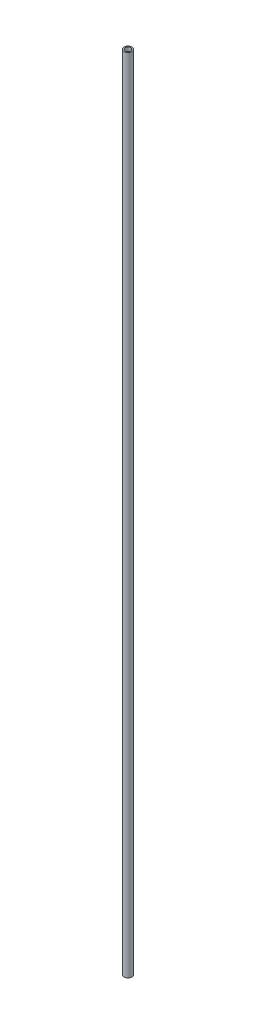
ISO-10303-21;
HEADER;
FILE_DESCRIPTION(('STEP AP214'),'2;1');
FILE_NAME('part.step','',(''),(''),'','','');
FILE_SCHEMA(('AUTOMOTIVE_DESIGN { 1 0 10303 214 1 1 1 1 }'));
ENDSEC;
DATA;
#1=APPLICATION_CONTEXT('core data for automotive mechanical design processes');
#2=APPLICATION_PROTOCOL_DEFINITION('international standard','automotive_design',2000,#1);
#3=PRODUCT_CONTEXT('',#1,'mechanical');
#4=PRODUCT('Part','Part','',(#3));
#5=PRODUCT_RELATED_PRODUCT_CATEGORY('part','',(#4));
#6=PRODUCT_DEFINITION_FORMATION('','',#4);
#7=PRODUCT_DEFINITION_CONTEXT('part definition',#1,'design');
#8=PRODUCT_DEFINITION('design','',#6,#7);
#9=PRODUCT_DEFINITION_SHAPE('','',#8);
#10=(LENGTH_UNIT() NAMED_UNIT(*) SI_UNIT(.MILLI.,.METRE.));
#11=(NAMED_UNIT(*) PLANE_ANGLE_UNIT() SI_UNIT($,.RADIAN.));
#12=(NAMED_UNIT(*) SI_UNIT($,.STERADIAN.) SOLID_ANGLE_UNIT());
#13=UNCERTAINTY_MEASURE_WITH_UNIT(LENGTH_MEASURE(1.E-05),#10,'distance_accuracy_value','');
#14=(GEOMETRIC_REPRESENTATION_CONTEXT(3) GLOBAL_UNCERTAINTY_ASSIGNED_CONTEXT((#13)) GLOBAL_UNIT_ASSIGNED_CONTEXT((#10,
#11,#12)) REPRESENTATION_CONTEXT('',''));
#15=CARTESIAN_POINT('',(0.,0.,0.));
#16=DIRECTION('',(0.,0.,1.));
#17=DIRECTION('',(1.,0.,0.));
#18=AXIS2_PLACEMENT_3D('',#15,#16,#17);
#19=CARTESIAN_POINT('',(0.,700.,0.));
#20=DIRECTION('',(0.,1.,0.));
#21=DIRECTION('',(0.,0.,1.));
#22=AXIS2_PLACEMENT_3D('',#19,#20,#21);
#23=PLANE('',#22);
#24=CARTESIAN_POINT('',(0.,700.,0.));
#25=DIRECTION('',(0.,1.,0.));
#26=DIRECTION('',(0.,0.,1.));
#27=AXIS2_PLACEMENT_3D('',#24,#25,#26);
#28=CIRCLE('',#27,3.5);
#29=CARTESIAN_POINT('',(0.,700.,3.5));
#30=VERTEX_POINT('',#29);
#31=EDGE_CURVE('E10',#30,#30,#28,.T.);
#32=ORIENTED_EDGE('',*,*,#31,.T.);
#33=EDGE_LOOP('',(#32));
#34=FACE_BOUND('',#33,.T.);
#35=CARTESIAN_POINT('',(0.,700.,0.));
#36=DIRECTION('',(0.,1.,0.));
#37=DIRECTION('',(0.,0.,1.));
#38=AXIS2_PLACEMENT_3D('',#35,#36,#37);
#39=CIRCLE('',#38,2.5);
#40=CARTESIAN_POINT('',(0.,700.,2.5));
#41=VERTEX_POINT('',#40);
#42=EDGE_CURVE('E46',#41,#41,#39,.T.);
#43=ORIENTED_EDGE('',*,*,#42,.F.);
#44=EDGE_LOOP('',(#43));
#45=FACE_BOUND('',#44,.T.);
#46=ADVANCED_FACE('F35',(#34,#45),#23,.T.);
#47=CARTESIAN_POINT('',(0.,0.,0.));
#48=DIRECTION('',(0.,1.,0.));
#49=DIRECTION('',(0.,0.,1.));
#50=AXIS2_PLACEMENT_3D('',#47,#48,#49);
#51=PLANE('',#50);
#52=CARTESIAN_POINT('',(0.,0.,0.));
#53=DIRECTION('',(0.,1.,0.));
#54=DIRECTION('',(0.,0.,1.));
#55=AXIS2_PLACEMENT_3D('',#52,#53,#54);
#56=CIRCLE('',#55,3.5);
#57=CARTESIAN_POINT('',(0.,0.,3.5));
#58=VERTEX_POINT('',#57);
#59=EDGE_CURVE('E39',#58,#58,#56,.T.);
#60=ORIENTED_EDGE('',*,*,#59,.F.);
#61=EDGE_LOOP('',(#60));
#62=FACE_BOUND('',#61,.T.);
#63=CARTESIAN_POINT('',(0.,0.,0.));
#64=DIRECTION('',(0.,1.,0.));
#65=DIRECTION('',(0.,0.,1.));
#66=AXIS2_PLACEMENT_3D('',#63,#64,#65);
#67=CIRCLE('',#66,2.5);
#68=CARTESIAN_POINT('',(0.,0.,2.5));
#69=VERTEX_POINT('',#68);
#70=EDGE_CURVE('E48',#69,#69,#67,.T.);
#71=ORIENTED_EDGE('',*,*,#70,.T.);
#72=EDGE_LOOP('',(#71));
#73=FACE_BOUND('',#72,.T.);
#74=ADVANCED_FACE('F58',(#62,#73),#51,.F.);
#75=CARTESIAN_POINT('',(0.,700.,0.));
#76=DIRECTION('',(0.,-1.,0.));
#77=DIRECTION('',(0.,0.,-1.));
#78=AXIS2_PLACEMENT_3D('',#75,#76,#77);
#79=CYLINDRICAL_SURFACE('',#78,3.5);
#80=ORIENTED_EDGE('',*,*,#31,.F.);
#81=EDGE_LOOP('',(#80));
#82=FACE_BOUND('',#81,.T.);
#83=ORIENTED_EDGE('',*,*,#59,.T.);
#84=EDGE_LOOP('',(#83));
#85=FACE_BOUND('',#84,.T.);
#86=ADVANCED_FACE('F37',(#82,#85),#79,.T.);
#87=CARTESIAN_POINT('',(0.,700.,0.));
#88=DIRECTION('',(0.,-1.,0.));
#89=DIRECTION('',(0.,0.,-1.));
#90=AXIS2_PLACEMENT_3D('',#87,#88,#89);
#91=CYLINDRICAL_SURFACE('',#90,2.5);
#92=ORIENTED_EDGE('',*,*,#42,.T.);
#93=EDGE_LOOP('',(#92));
#94=FACE_BOUND('',#93,.T.);
#95=ORIENTED_EDGE('',*,*,#70,.F.);
#96=EDGE_LOOP('',(#95));
#97=FACE_BOUND('',#96,.T.);
#98=ADVANCED_FACE('F54',(#94,#97),#91,.F.);
#99=CLOSED_SHELL('',(#46,#74,#86,#98));
#100=MANIFOLD_SOLID_BREP('B2',#99);
#101=ADVANCED_BREP_SHAPE_REPRESENTATION('',(#18,#100),#14);
#102=SHAPE_DEFINITION_REPRESENTATION(#9,#101);
ENDSEC;
END-ISO-10303-21;
